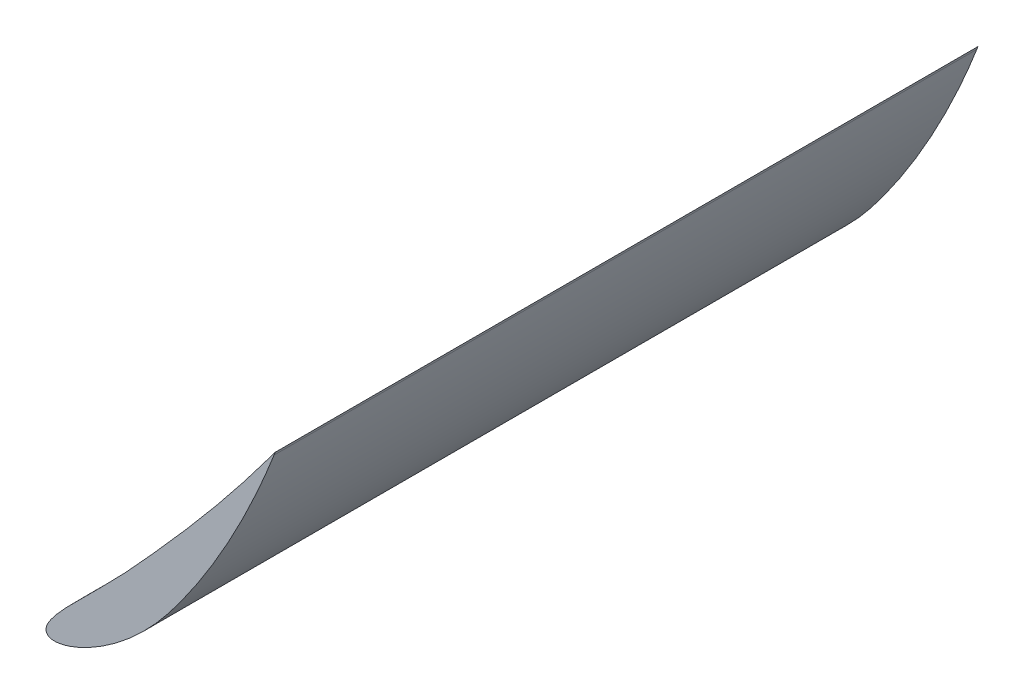
ISO-10303-21;
HEADER;
FILE_DESCRIPTION(('STEP AP214'),'2;1');
FILE_NAME('part.step','',(''),(''),'','','');
FILE_SCHEMA(('AUTOMOTIVE_DESIGN { 1 0 10303 214 1 1 1 1 }'));
ENDSEC;
DATA;
#1=APPLICATION_CONTEXT('core data for automotive mechanical design processes');
#2=APPLICATION_PROTOCOL_DEFINITION('international standard','automotive_design',2000,#1);
#3=PRODUCT_CONTEXT('',#1,'mechanical');
#4=PRODUCT('Part','Part','',(#3));
#5=PRODUCT_RELATED_PRODUCT_CATEGORY('part','',(#4));
#6=PRODUCT_DEFINITION_FORMATION('','',#4);
#7=PRODUCT_DEFINITION_CONTEXT('part definition',#1,'design');
#8=PRODUCT_DEFINITION('design','',#6,#7);
#9=PRODUCT_DEFINITION_SHAPE('','',#8);
#10=(LENGTH_UNIT() NAMED_UNIT(*) SI_UNIT(.MILLI.,.METRE.));
#11=(NAMED_UNIT(*) PLANE_ANGLE_UNIT() SI_UNIT($,.RADIAN.));
#12=(NAMED_UNIT(*) SI_UNIT($,.STERADIAN.) SOLID_ANGLE_UNIT());
#13=UNCERTAINTY_MEASURE_WITH_UNIT(LENGTH_MEASURE(1.E-05),#10,'distance_accuracy_value','');
#14=(GEOMETRIC_REPRESENTATION_CONTEXT(3) GLOBAL_UNCERTAINTY_ASSIGNED_CONTEXT((#13)) GLOBAL_UNIT_ASSIGNED_CONTEXT((#10,
#11,#12)) REPRESENTATION_CONTEXT('',''));
#15=CARTESIAN_POINT('',(0.,0.,0.));
#16=DIRECTION('',(0.,0.,1.));
#17=DIRECTION('',(1.,0.,0.));
#18=AXIS2_PLACEMENT_3D('',#15,#16,#17);
#19=CARTESIAN_POINT('',(81.5114443447214,97.3905028588164,254.));
#20=CARTESIAN_POINT('',(81.4724993485904,97.3380225949964,254.));
#21=CARTESIAN_POINT('',(81.3169275021705,97.1283820158827,254.));
#22=CARTESIAN_POINT('',(80.9673240105217,96.6582939535566,254.));
#23=CARTESIAN_POINT('',(80.3866634497469,95.8783557208887,254.));
#24=CARTESIAN_POINT('',(79.5770452474423,94.7946632231762,254.));
#25=CARTESIAN_POINT('',(78.5420168819516,93.4150335321203,254.));
#26=CARTESIAN_POINT('',(77.2860055830285,91.7496774249787,254.));
#27=CARTESIAN_POINT('',(75.8139822007672,89.811085714328,254.));
#28=CARTESIAN_POINT('',(74.1325354546522,87.6134240911832,254.));
#29=CARTESIAN_POINT('',(72.2484756306872,85.173105700979,254.));
#30=CARTESIAN_POINT('',(70.1703117098976,82.5078774760904,254.));
#31=CARTESIAN_POINT('',(67.9066182566043,79.6376394273435,254.));
#32=CARTESIAN_POINT('',(65.4680439404062,76.5828753592974,254.));
#33=CARTESIAN_POINT('',(62.8659029490468,73.3655234144295,254.));
#34=CARTESIAN_POINT('',(60.1132970015813,70.0079239798094,254.));
#35=CARTESIAN_POINT('',(57.224003934688,66.5334424291232,254.));
#36=CARTESIAN_POINT('',(54.214433494237,62.9647475783509,254.));
#37=CARTESIAN_POINT('',(51.1016295950607,59.3250196994085,254.));
#38=CARTESIAN_POINT('',(47.904878914804,55.6367857888698,254.));
#39=CARTESIAN_POINT('',(44.6451849265602,51.9215492818983,254.));
#40=CARTESIAN_POINT('',(41.3442542622628,48.200989973003,254.));
#41=CARTESIAN_POINT('',(38.0268826260598,44.4942411623332,254.));
#42=CARTESIAN_POINT('',(34.7151331807116,40.8229057150131,254.));
#43=CARTESIAN_POINT('',(31.4437054803405,37.1956194014633,254.));
#44=CARTESIAN_POINT('',(28.1716511772458,33.689144272971,254.));
#45=CARTESIAN_POINT('',(24.9329675553549,30.3129564992293,254.));
#46=CARTESIAN_POINT('',(21.7584613379498,27.0784007511719,254.));
#47=CARTESIAN_POINT('',(18.680606539026,23.994591950362,254.));
#48=CARTESIAN_POINT('',(15.7314203046224,21.06951333977,254.));
#49=CARTESIAN_POINT('',(12.9427394417428,18.3096104806926,254.));
#50=CARTESIAN_POINT('',(10.3447106753002,15.7209159734472,254.));
#51=CARTESIAN_POINT('',(7.96645250791072,13.308114525057,254.));
#52=CARTESIAN_POINT('',(5.83397860759154,11.0762653040573,254.));
#53=CARTESIAN_POINT('',(3.9718012371945,9.0290764036871,254.));
#54=CARTESIAN_POINT('',(2.40061268825594,7.1703754864227,254.));
#55=CARTESIAN_POINT('',(1.13795411614651,5.5031230482489,254.));
#56=CARTESIAN_POINT('',(0.196818823955751,4.02854127904879,254.));
#57=CARTESIAN_POINT('',(-0.413303284674985,2.74288328760045,254.));
#58=CARTESIAN_POINT('',(-0.688610929824668,1.63206193677624,254.));
#59=CARTESIAN_POINT('',(-0.579008281910862,0.660655586255031,254.));
#60=CARTESIAN_POINT('',(-0.01340114277953,-0.0818041355518172,254.));
#61=CARTESIAN_POINT('',(0.896547455097208,-0.525082577923026,254.));
#62=CARTESIAN_POINT('',(2.0899547098991,-0.700909761060795,254.));
#63=CARTESIAN_POINT('',(3.56512361435132,-0.632851232224614,254.));
#64=CARTESIAN_POINT('',(5.32149888486379,-0.320057439984938,254.));
#65=CARTESIAN_POINT('',(7.34744690523965,0.242219484071431,254.));
#66=CARTESIAN_POINT('',(9.62319691470315,1.06131285816329,254.));
#67=CARTESIAN_POINT('',(12.1246315617029,2.14234662593492,254.));
#68=CARTESIAN_POINT('',(14.8236928496724,3.490992147618,254.));
#69=CARTESIAN_POINT('',(17.6904455460199,5.1107765009458,254.));
#70=CARTESIAN_POINT('',(20.6931764793858,7.00404357682187,254.));
#71=CARTESIAN_POINT('',(23.7993302752129,9.17140481500294,254.));
#72=CARTESIAN_POINT('',(26.9767119808995,11.6104836738946,254.));
#73=CARTESIAN_POINT('',(30.1932055782075,14.3169861719907,254.));
#74=CARTESIAN_POINT('',(33.4182576468309,17.2830944674401,254.));
#75=CARTESIAN_POINT('',(36.6226503417414,20.4983758726733,254.));
#76=CARTESIAN_POINT('',(39.7791575955441,23.9490027515416,254.));
#77=CARTESIAN_POINT('',(42.8637366967801,27.6176498034936,254.));
#78=CARTESIAN_POINT('',(45.8490898411578,31.4846984197134,254.));
#79=CARTESIAN_POINT('',(48.7893665464483,35.469289230331,254.));
#80=CARTESIAN_POINT('',(51.6592639694819,39.5528452886554,254.));
#81=CARTESIAN_POINT('',(54.4471040122331,43.7050018335023,254.));
#82=CARTESIAN_POINT('',(57.1391174349363,47.8972665535154,254.));
#83=CARTESIAN_POINT('',(59.7244179754414,52.0990676484756,254.));
#84=CARTESIAN_POINT('',(62.1920438941697,56.2803672723147,254.));
#85=CARTESIAN_POINT('',(64.532921640334,60.4101269630917,254.));
#86=CARTESIAN_POINT('',(66.7394203505399,64.4573537053992,254.));
#87=CARTESIAN_POINT('',(68.8046325048246,68.3913550659398,254.));
#88=CARTESIAN_POINT('',(70.7234345865292,72.1816303783077,254.));
#89=CARTESIAN_POINT('',(72.491153274974,75.7986432311619,254.));
#90=CARTESIAN_POINT('',(74.1049505837911,79.2134067515905,254.));
#91=CARTESIAN_POINT('',(75.563174617972,82.3980510598886,254.));
#92=CARTESIAN_POINT('',(76.864331348118,85.326520379045,254.));
#93=CARTESIAN_POINT('',(78.0085992110131,87.9739739115741,254.));
#94=CARTESIAN_POINT('',(78.9965168529994,90.3178191920208,254.));
#95=CARTESIAN_POINT('',(79.8290460209961,92.3376130309087,254.));
#96=CARTESIAN_POINT('',(80.5075030110646,94.0156040681829,254.));
#97=CARTESIAN_POINT('',(81.0333649450307,95.3367164755296,254.));
#98=CARTESIAN_POINT('',(81.4077281686149,96.2891718618193,254.));
#99=CARTESIAN_POINT('',(81.6321320939616,96.8640427065085,254.));
#100=CARTESIAN_POINT('',(81.7316792002867,97.1205494069967,254.));
#101=CARTESIAN_POINT('',(81.7566085156607,97.1847856934033,254.));
#102=B_SPLINE_CURVE_WITH_KNOTS('',3,(#19,#20,#21,#22,#23,#24,#25,#26,#27,#28,#29,#30,#31,#32,
#33,#34,#35,#36,#37,#38,#39,#40,#41,#42,#43,#44,#45,#46,#47,#48,#49,#50,#51,#52,#53,#54,#55,#56,
#57,#58,#59,#60,#61,#62,#63,#64,#65,#66,#67,#68,#69,#70,#71,#72,#73,#74,#75,#76,#77,#78,#79,#80,
#81,#82,#83,#84,#85,#86,#87,#88,#89,#90,#91,#92,#93,#94,#95,#96,#97,#98,#99,#100,#101),
.UNSPECIFIED.,.F.,.F.,(4,1,1,1,1,1,1,1,1,1,1,1,1,1,1,1,1,1,1,1,1,1,1,1,1,1,1,1,1,1,1,1,1,1,1,1,
1,1,1,1,1,1,1,1,1,1,1,1,1,1,1,1,1,1,1,1,1,1,1,1,1,1,1,1,1,1,1,1,1,1,1,1,1,1,1,1,1,1,1,1,4),(0.,
0.000750513501971195,0.00299804295428685,0.00672784940377236,0.0119171706525508,
0.0185329713263098,0.026534805613309,0.0358719389384909,0.0464868619139933,0.0583128283132623,
0.0712773849994469,0.0852994283936014,0.100292782778247,0.116165673834452,0.132819784938735,
0.150153116370067,0.168060493162749,0.18643095732459,0.205153508431755,0.224112105695577,
0.243191419595248,0.262273248918981,0.281238994312411,0.299973133201852,0.318367875682616,
0.336314444831389,0.353699728178519,0.370414229508711,0.386350073996083,0.401402198899796,
0.415472291888822,0.428468847070347,0.440308267572275,0.450919872749776,0.460245935875565,
0.468249663818777,0.47492187606895,0.480303629236668,0.484529405053291,0.487929891183724,
0.49113735242087,0.494782629666708,0.49927184258141,0.504867269579987,0.511674811850919,
0.519719915105306,0.528985613085521,0.539430032020974,0.550996930431098,0.563619975082369,
0.577228754188619,0.591747770545967,0.607101620883268,0.623214138669307,0.640007660113029,
0.657405010167299,0.675329003903349,0.693698678149423,0.712431881974785,0.731423114535592,
0.750564737004094,0.769745998457317,0.788854221163154,0.807776971836167,0.826399187090761,
0.844608489708695,0.862290408781229,0.879334612387501,0.895632214479611,0.911076793640884,
0.925566896965723,0.939005567967945,0.951300576603228,0.962367399370791,0.972127178235692,
0.9805106388094,0.987455983158366,0.992912933292426,0.996840179326193,0.999208694566608,1.),.UNSPECIFIED.);
#103=DIRECTION('',(0.,0.,-1.));
#104=VECTOR('',#103,1.);
#105=SURFACE_OF_LINEAR_EXTRUSION('',#102,#104);
#106=CARTESIAN_POINT('',(81.5114443447214,97.3905028588164,0.));
#107=CARTESIAN_POINT('',(81.4724993485904,97.3380225949964,0.));
#108=CARTESIAN_POINT('',(81.3169275021705,97.1283820158827,0.));
#109=CARTESIAN_POINT('',(80.9673240105217,96.6582939535566,0.));
#110=CARTESIAN_POINT('',(80.3866634497469,95.8783557208887,0.));
#111=CARTESIAN_POINT('',(79.5770452474423,94.7946632231762,0.));
#112=CARTESIAN_POINT('',(78.5420168819516,93.4150335321203,0.));
#113=CARTESIAN_POINT('',(77.2860055830285,91.7496774249787,0.));
#114=CARTESIAN_POINT('',(75.8139822007672,89.811085714328,0.));
#115=CARTESIAN_POINT('',(74.1325354546522,87.6134240911832,0.));
#116=CARTESIAN_POINT('',(72.2484756306872,85.173105700979,0.));
#117=CARTESIAN_POINT('',(70.1703117098976,82.5078774760904,0.));
#118=CARTESIAN_POINT('',(67.9066182566043,79.6376394273435,0.));
#119=CARTESIAN_POINT('',(65.4680439404062,76.5828753592974,0.));
#120=CARTESIAN_POINT('',(62.8659029490468,73.3655234144295,0.));
#121=CARTESIAN_POINT('',(60.1132970015813,70.0079239798094,0.));
#122=CARTESIAN_POINT('',(57.224003934688,66.5334424291232,0.));
#123=CARTESIAN_POINT('',(54.214433494237,62.9647475783509,0.));
#124=CARTESIAN_POINT('',(51.1016295950607,59.3250196994085,0.));
#125=CARTESIAN_POINT('',(47.904878914804,55.6367857888698,0.));
#126=CARTESIAN_POINT('',(44.6451849265602,51.9215492818983,0.));
#127=CARTESIAN_POINT('',(41.3442542622628,48.200989973003,0.));
#128=CARTESIAN_POINT('',(38.0268826260598,44.4942411623332,0.));
#129=CARTESIAN_POINT('',(34.7151331807116,40.8229057150131,0.));
#130=CARTESIAN_POINT('',(31.4437054803405,37.1956194014633,0.));
#131=CARTESIAN_POINT('',(28.1716511772458,33.689144272971,0.));
#132=CARTESIAN_POINT('',(24.9329675553549,30.3129564992293,0.));
#133=CARTESIAN_POINT('',(21.7584613379498,27.0784007511719,0.));
#134=CARTESIAN_POINT('',(18.680606539026,23.994591950362,0.));
#135=CARTESIAN_POINT('',(15.7314203046224,21.06951333977,0.));
#136=CARTESIAN_POINT('',(12.9427394417428,18.3096104806926,0.));
#137=CARTESIAN_POINT('',(10.3447106753002,15.7209159734472,0.));
#138=CARTESIAN_POINT('',(7.96645250791072,13.308114525057,0.));
#139=CARTESIAN_POINT('',(5.83397860759154,11.0762653040573,0.));
#140=CARTESIAN_POINT('',(3.9718012371945,9.0290764036871,0.));
#141=CARTESIAN_POINT('',(2.40061268825594,7.1703754864227,0.));
#142=CARTESIAN_POINT('',(1.13795411614651,5.5031230482489,0.));
#143=CARTESIAN_POINT('',(0.196818823955751,4.02854127904879,0.));
#144=CARTESIAN_POINT('',(-0.413303284674985,2.74288328760045,0.));
#145=CARTESIAN_POINT('',(-0.688610929824668,1.63206193677624,0.));
#146=CARTESIAN_POINT('',(-0.579008281910862,0.660655586255031,0.));
#147=CARTESIAN_POINT('',(-0.01340114277953,-0.0818041355518172,0.));
#148=CARTESIAN_POINT('',(0.896547455097208,-0.525082577923026,0.));
#149=CARTESIAN_POINT('',(2.0899547098991,-0.700909761060795,0.));
#150=CARTESIAN_POINT('',(3.56512361435132,-0.632851232224614,0.));
#151=CARTESIAN_POINT('',(5.32149888486379,-0.320057439984938,0.));
#152=CARTESIAN_POINT('',(7.34744690523965,0.242219484071431,0.));
#153=CARTESIAN_POINT('',(9.62319691470315,1.06131285816329,0.));
#154=CARTESIAN_POINT('',(12.1246315617029,2.14234662593492,0.));
#155=CARTESIAN_POINT('',(14.8236928496724,3.490992147618,0.));
#156=CARTESIAN_POINT('',(17.6904455460199,5.1107765009458,0.));
#157=CARTESIAN_POINT('',(20.6931764793858,7.00404357682187,0.));
#158=CARTESIAN_POINT('',(23.7993302752129,9.17140481500294,0.));
#159=CARTESIAN_POINT('',(26.9767119808995,11.6104836738946,0.));
#160=CARTESIAN_POINT('',(30.1932055782075,14.3169861719907,0.));
#161=CARTESIAN_POINT('',(33.4182576468309,17.2830944674401,0.));
#162=CARTESIAN_POINT('',(36.6226503417414,20.4983758726733,0.));
#163=CARTESIAN_POINT('',(39.7791575955441,23.9490027515416,0.));
#164=CARTESIAN_POINT('',(42.8637366967801,27.6176498034936,0.));
#165=CARTESIAN_POINT('',(45.8490898411578,31.4846984197134,0.));
#166=CARTESIAN_POINT('',(48.7893665464483,35.469289230331,0.));
#167=CARTESIAN_POINT('',(51.6592639694819,39.5528452886554,0.));
#168=CARTESIAN_POINT('',(54.4471040122331,43.7050018335023,0.));
#169=CARTESIAN_POINT('',(57.1391174349363,47.8972665535154,0.));
#170=CARTESIAN_POINT('',(59.7244179754414,52.0990676484756,0.));
#171=CARTESIAN_POINT('',(62.1920438941697,56.2803672723147,0.));
#172=CARTESIAN_POINT('',(64.532921640334,60.4101269630917,0.));
#173=CARTESIAN_POINT('',(66.7394203505399,64.4573537053992,0.));
#174=CARTESIAN_POINT('',(68.8046325048246,68.3913550659398,0.));
#175=CARTESIAN_POINT('',(70.7234345865292,72.1816303783077,0.));
#176=CARTESIAN_POINT('',(72.491153274974,75.7986432311619,0.));
#177=CARTESIAN_POINT('',(74.1049505837911,79.2134067515905,0.));
#178=CARTESIAN_POINT('',(75.563174617972,82.3980510598886,0.));
#179=CARTESIAN_POINT('',(76.864331348118,85.326520379045,0.));
#180=CARTESIAN_POINT('',(78.0085992110131,87.9739739115741,0.));
#181=CARTESIAN_POINT('',(78.9965168529994,90.3178191920208,0.));
#182=CARTESIAN_POINT('',(79.8290460209961,92.3376130309087,0.));
#183=CARTESIAN_POINT('',(80.5075030110646,94.0156040681829,0.));
#184=CARTESIAN_POINT('',(81.0333649450307,95.3367164755296,0.));
#185=CARTESIAN_POINT('',(81.4077281686149,96.2891718618193,0.));
#186=CARTESIAN_POINT('',(81.6321320939616,96.8640427065085,0.));
#187=CARTESIAN_POINT('',(81.7316792002867,97.1205494069967,0.));
#188=CARTESIAN_POINT('',(81.7566085156607,97.1847856934033,0.));
#189=B_SPLINE_CURVE_WITH_KNOTS('',3,(#106,#107,#108,#109,#110,#111,#112,#113,#114,#115,#116,
#117,#118,#119,#120,#121,#122,#123,#124,#125,#126,#127,#128,#129,#130,#131,#132,#133,#134,#135,
#136,#137,#138,#139,#140,#141,#142,#143,#144,#145,#146,#147,#148,#149,#150,#151,#152,#153,#154,
#155,#156,#157,#158,#159,#160,#161,#162,#163,#164,#165,#166,#167,#168,#169,#170,#171,#172,#173,
#174,#175,#176,#177,#178,#179,#180,#181,#182,#183,#184,#185,#186,#187,#188),.UNSPECIFIED.,.F.,
.F.,(4,1,1,1,1,1,1,1,1,1,1,1,1,1,1,1,1,1,1,1,1,1,1,1,1,1,1,1,1,1,1,1,1,1,1,1,1,1,1,1,1,1,1,1,1,
1,1,1,1,1,1,1,1,1,1,1,1,1,1,1,1,1,1,1,1,1,1,1,1,1,1,1,1,1,1,1,1,1,1,1,4),(0.,
0.000750513501971195,0.00299804295428685,0.00672784940377236,0.0119171706525508,
0.0185329713263098,0.026534805613309,0.0358719389384909,0.0464868619139933,0.0583128283132623,
0.0712773849994469,0.0852994283936014,0.100292782778247,0.116165673834452,0.132819784938735,
0.150153116370067,0.168060493162749,0.18643095732459,0.205153508431755,0.224112105695577,
0.243191419595248,0.262273248918981,0.281238994312411,0.299973133201852,0.318367875682616,
0.336314444831389,0.353699728178519,0.370414229508711,0.386350073996083,0.401402198899796,
0.415472291888822,0.428468847070347,0.440308267572275,0.450919872749776,0.460245935875565,
0.468249663818777,0.47492187606895,0.480303629236668,0.484529405053291,0.487929891183724,
0.49113735242087,0.494782629666708,0.49927184258141,0.504867269579987,0.511674811850919,
0.519719915105306,0.528985613085521,0.539430032020974,0.550996930431098,0.563619975082369,
0.577228754188619,0.591747770545967,0.607101620883268,0.623214138669307,0.640007660113029,
0.657405010167299,0.675329003903349,0.693698678149423,0.712431881974785,0.731423114535592,
0.750564737004094,0.769745998457317,0.788854221163154,0.807776971836167,0.826399187090761,
0.844608489708695,0.862290408781229,0.879334612387501,0.895632214479611,0.911076793640884,
0.925566896965723,0.939005567967945,0.951300576603228,0.962367399370791,0.972127178235692,
0.9805106388094,0.987455983158366,0.992912933292426,0.996840179326193,0.999208694566608,1.),.UNSPECIFIED.);
#190=CARTESIAN_POINT('',(81.5114443447213,97.3905028588163,0.));
#191=VERTEX_POINT('',#190);
#192=CARTESIAN_POINT('',(81.7566085156607,97.1847856934032,0.));
#193=VERTEX_POINT('',#192);
#194=EDGE_CURVE('E79',#191,#193,#189,.T.);
#195=ORIENTED_EDGE('',*,*,#194,.T.);
#196=DIRECTION('',(0.,0.,-1.));
#197=VECTOR('',#196,1.);
#198=CARTESIAN_POINT('',(81.7566085156607,97.1847856934032,254.));
#199=LINE('',#198,#197);
#200=CARTESIAN_POINT('',(81.7566085156607,97.1847856934032,254.));
#201=VERTEX_POINT('',#200);
#202=EDGE_CURVE('E11',#201,#193,#199,.T.);
#203=ORIENTED_EDGE('',*,*,#202,.F.);
#204=CARTESIAN_POINT('',(81.5114443447213,97.3905028588163,254.));
#205=VERTEX_POINT('',#204);
#206=EDGE_CURVE('E73',#205,#201,#102,.T.);
#207=ORIENTED_EDGE('',*,*,#206,.F.);
#208=DIRECTION('',(0.,0.,-1.));
#209=VECTOR('',#208,1.);
#210=CARTESIAN_POINT('',(81.5114443447213,97.3905028588163,254.));
#211=LINE('',#210,#209);
#212=EDGE_CURVE('E80',#205,#191,#211,.T.);
#213=ORIENTED_EDGE('',*,*,#212,.T.);
#214=EDGE_LOOP('',(#195,#203,#207,#213));
#215=FACE_BOUND('',#214,.T.);
#216=ADVANCED_FACE('F32',(#215),#105,.F.);
#217=CARTESIAN_POINT('',(81.7566085156607,97.1847856934032,254.));
#218=DIRECTION('',(-0.932256741043418,0.361797414002788,0.));
#219=DIRECTION('',(-0.361797414002788,-0.932256741043418,0.));
#220=AXIS2_PLACEMENT_3D('',#217,#218,#219);
#221=PLANE('',#220);
#222=DIRECTION('',(0.361797414002788,0.932256741043418,0.));
#223=VECTOR('',#222,1.);
#224=CARTESIAN_POINT('',(81.7566085156607,97.1847856934032,0.));
#225=LINE('',#224,#223);
#226=CARTESIAN_POINT('',(82.1927399139845,98.3085815535499,0.));
#227=VERTEX_POINT('',#226);
#228=EDGE_CURVE('E61',#193,#227,#225,.T.);
#229=ORIENTED_EDGE('',*,*,#228,.T.);
#230=DIRECTION('',(0.,0.,-1.));
#231=VECTOR('',#230,1.);
#232=CARTESIAN_POINT('',(82.1927399139845,98.3085815535499,254.));
#233=LINE('',#232,#231);
#234=CARTESIAN_POINT('',(82.1927399139845,98.3085815535499,254.));
#235=VERTEX_POINT('',#234);
#236=EDGE_CURVE('E41',#235,#227,#233,.T.);
#237=ORIENTED_EDGE('',*,*,#236,.F.);
#238=DIRECTION('',(0.361797414002788,0.932256741043418,0.));
#239=VECTOR('',#238,1.);
#240=CARTESIAN_POINT('',(81.7566085156607,97.1847856934032,254.));
#241=LINE('',#240,#239);
#242=EDGE_CURVE('E69',#201,#235,#241,.T.);
#243=ORIENTED_EDGE('',*,*,#242,.F.);
#244=ORIENTED_EDGE('',*,*,#202,.T.);
#245=EDGE_LOOP('',(#229,#237,#243,#244));
#246=FACE_BOUND('',#245,.T.);
#247=ADVANCED_FACE('F70',(#246),#221,.F.);
#248=CARTESIAN_POINT('',(81.5114443447213,97.3905028588163,254.));
#249=DIRECTION('',(0.803039254555529,-0.595926132706815,0.));
#250=DIRECTION('',(0.595926132706815,0.803039254555529,0.));
#251=AXIS2_PLACEMENT_3D('',#248,#249,#250);
#252=PLANE('',#251);
#253=DIRECTION('',(-0.595926132706815,-0.803039254555529,0.));
#254=VECTOR('',#253,1.);
#255=CARTESIAN_POINT('',(81.5114443447213,97.3905028588163,0.));
#256=LINE('',#255,#254);
#257=EDGE_CURVE('E66',#227,#191,#256,.T.);
#258=ORIENTED_EDGE('',*,*,#257,.T.);
#259=ORIENTED_EDGE('',*,*,#212,.F.);
#260=DIRECTION('',(-0.595926132706815,-0.803039254555529,0.));
#261=VECTOR('',#260,1.);
#262=CARTESIAN_POINT('',(81.5114443447213,97.3905028588163,254.));
#263=LINE('',#262,#261);
#264=EDGE_CURVE('E49',#235,#205,#263,.T.);
#265=ORIENTED_EDGE('',*,*,#264,.F.);
#266=ORIENTED_EDGE('',*,*,#236,.T.);
#267=EDGE_LOOP('',(#258,#259,#265,#266));
#268=FACE_BOUND('',#267,.T.);
#269=ADVANCED_FACE('F92',(#268),#252,.F.);
#270=CARTESIAN_POINT('',(2.18494371724588,-0.662101143585002,254.));
#271=DIRECTION('',(0.,0.,1.));
#272=DIRECTION('',(1.,0.,0.));
#273=AXIS2_PLACEMENT_3D('',#270,#271,#272);
#274=PLANE('',#273);
#275=ORIENTED_EDGE('',*,*,#206,.T.);
#276=ORIENTED_EDGE('',*,*,#242,.T.);
#277=ORIENTED_EDGE('',*,*,#264,.T.);
#278=EDGE_LOOP('',(#275,#276,#277));
#279=FACE_BOUND('',#278,.T.);
#280=ADVANCED_FACE('F76',(#279),#274,.T.);
#281=CARTESIAN_POINT('',(2.18494371724588,-0.662101143585002,0.));
#282=DIRECTION('',(0.,0.,1.));
#283=DIRECTION('',(1.,0.,0.));
#284=AXIS2_PLACEMENT_3D('',#281,#282,#283);
#285=PLANE('',#284);
#286=ORIENTED_EDGE('',*,*,#194,.F.);
#287=ORIENTED_EDGE('',*,*,#257,.F.);
#288=ORIENTED_EDGE('',*,*,#228,.F.);
#289=EDGE_LOOP('',(#286,#287,#288));
#290=FACE_BOUND('',#289,.T.);
#291=ADVANCED_FACE('F93',(#290),#285,.F.);
#292=CLOSED_SHELL('',(#216,#247,#269,#280,#291));
#293=MANIFOLD_SOLID_BREP('B2',#292);
#294=ADVANCED_BREP_SHAPE_REPRESENTATION('',(#18,#293),#14);
#295=SHAPE_DEFINITION_REPRESENTATION(#9,#294);
ENDSEC;
END-ISO-10303-21;
